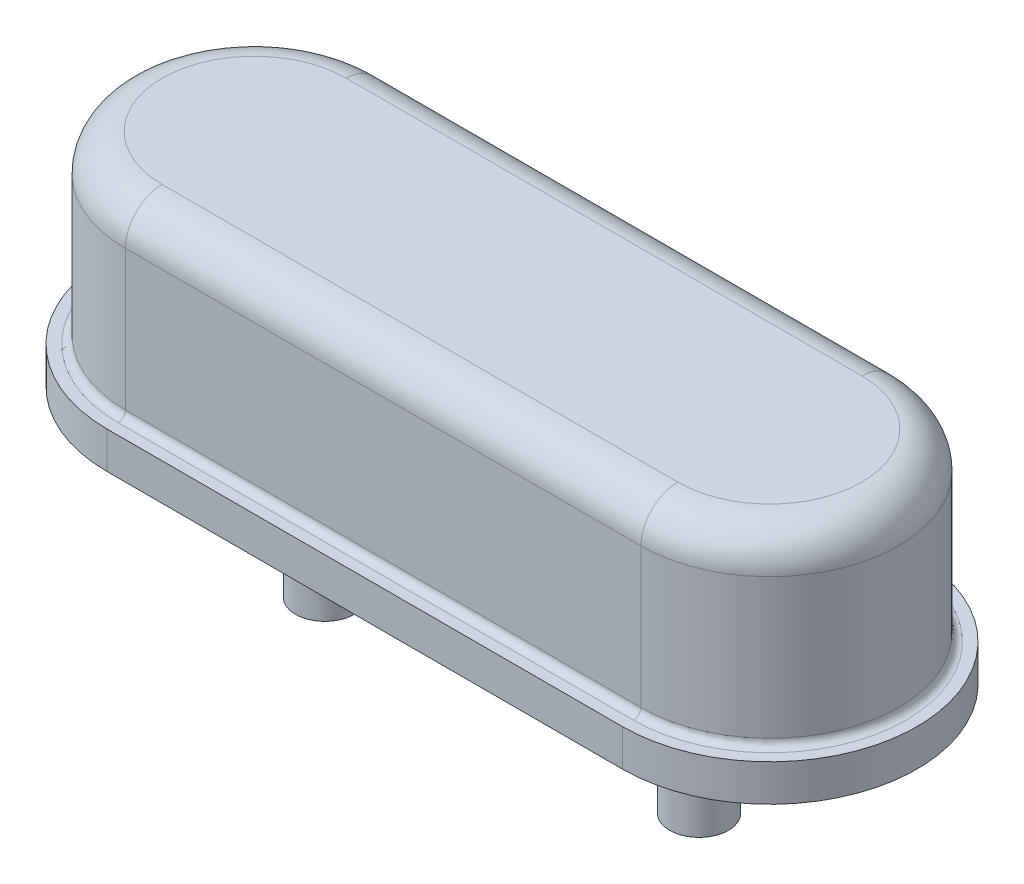
ISO-10303-21;
HEADER;
FILE_DESCRIPTION(('STEP AP214'),'2;1');
FILE_NAME('part.step','',(''),(''),'','','');
FILE_SCHEMA(('AUTOMOTIVE_DESIGN { 1 0 10303 214 1 1 1 1 }'));
ENDSEC;
DATA;
#1=APPLICATION_CONTEXT('core data for automotive mechanical design processes');
#2=APPLICATION_PROTOCOL_DEFINITION('international standard','automotive_design',2000,#1);
#3=PRODUCT_CONTEXT('',#1,'mechanical');
#4=PRODUCT('Part','Part','',(#3));
#5=PRODUCT_RELATED_PRODUCT_CATEGORY('part','',(#4));
#6=PRODUCT_DEFINITION_FORMATION('','',#4);
#7=PRODUCT_DEFINITION_CONTEXT('part definition',#1,'design');
#8=PRODUCT_DEFINITION('design','',#6,#7);
#9=PRODUCT_DEFINITION_SHAPE('','',#8);
#10=(LENGTH_UNIT() NAMED_UNIT(*) SI_UNIT(.MILLI.,.METRE.));
#11=(NAMED_UNIT(*) PLANE_ANGLE_UNIT() SI_UNIT($,.RADIAN.));
#12=(NAMED_UNIT(*) SI_UNIT($,.STERADIAN.) SOLID_ANGLE_UNIT());
#13=UNCERTAINTY_MEASURE_WITH_UNIT(LENGTH_MEASURE(1.E-05),#10,'distance_accuracy_value','');
#14=(GEOMETRIC_REPRESENTATION_CONTEXT(3) GLOBAL_UNCERTAINTY_ASSIGNED_CONTEXT((#13)) GLOBAL_UNIT_ASSIGNED_CONTEXT((#10,
#11,#12)) REPRESENTATION_CONTEXT('',''));
#15=CARTESIAN_POINT('',(0.,0.,0.));
#16=DIRECTION('',(0.,0.,1.));
#17=DIRECTION('',(1.,0.,0.));
#18=AXIS2_PLACEMENT_3D('',#15,#16,#17);
#19=CARTESIAN_POINT('',(-3.5,3.,0.));
#20=DIRECTION('',(0.,-1.,0.));
#21=DIRECTION('',(0.,0.,-1.));
#22=AXIS2_PLACEMENT_3D('',#19,#20,#21);
#23=CYLINDRICAL_SURFACE('',#22,2.);
#24=CARTESIAN_POINT('',(-3.5,0.5,0.));
#25=DIRECTION('',(0.,1.,0.));
#26=DIRECTION('',(0.,0.,1.));
#27=AXIS2_PLACEMENT_3D('',#24,#25,#26);
#28=CIRCLE('',#27,2.);
#29=CARTESIAN_POINT('',(-3.5,0.5,-2.));
#30=VERTEX_POINT('',#29);
#31=CARTESIAN_POINT('',(-3.5,0.5,2.));
#32=VERTEX_POINT('',#31);
#33=EDGE_CURVE('E121',#30,#32,#28,.T.);
#34=ORIENTED_EDGE('',*,*,#33,.F.);
#35=DIRECTION('',(0.,-1.,0.));
#36=VECTOR('',#35,1.);
#37=CARTESIAN_POINT('',(-3.5,3.,-2.));
#38=LINE('',#37,#36);
#39=CARTESIAN_POINT('',(-3.5,0.,-2.));
#40=VERTEX_POINT('',#39);
#41=EDGE_CURVE('E243',#30,#40,#38,.T.);
#42=ORIENTED_EDGE('',*,*,#41,.T.);
#43=CARTESIAN_POINT('',(-3.5,0.,0.));
#44=DIRECTION('',(0.,1.,0.));
#45=DIRECTION('',(0.,0.,1.));
#46=AXIS2_PLACEMENT_3D('',#43,#44,#45);
#47=CIRCLE('',#46,2.);
#48=CARTESIAN_POINT('',(-3.5,0.,2.));
#49=VERTEX_POINT('',#48);
#50=EDGE_CURVE('E144',#40,#49,#47,.T.);
#51=ORIENTED_EDGE('',*,*,#50,.T.);
#52=DIRECTION('',(0.,-1.,0.));
#53=VECTOR('',#52,1.);
#54=CARTESIAN_POINT('',(-3.5,3.,2.));
#55=LINE('',#54,#53);
#56=EDGE_CURVE('E137',#32,#49,#55,.T.);
#57=ORIENTED_EDGE('',*,*,#56,.F.);
#58=EDGE_LOOP('',(#34,#42,#51,#57));
#59=FACE_BOUND('',#58,.T.);
#60=ADVANCED_FACE('F33',(#59),#23,.T.);
#61=CARTESIAN_POINT('',(-3.5,3.,2.));
#62=DIRECTION('',(0.,0.,-1.));
#63=DIRECTION('',(-1.,0.,0.));
#64=AXIS2_PLACEMENT_3D('',#61,#62,#63);
#65=PLANE('',#64);
#66=DIRECTION('',(1.,0.,0.));
#67=VECTOR('',#66,1.);
#68=CARTESIAN_POINT('',(-3.5,0.5,2.));
#69=LINE('',#68,#67);
#70=CARTESIAN_POINT('',(3.5,0.5,2.));
#71=VERTEX_POINT('',#70);
#72=EDGE_CURVE('E124',#32,#71,#69,.T.);
#73=ORIENTED_EDGE('',*,*,#72,.F.);
#74=ORIENTED_EDGE('',*,*,#56,.T.);
#75=DIRECTION('',(1.,0.,0.));
#76=VECTOR('',#75,1.);
#77=CARTESIAN_POINT('',(-3.5,0.,2.));
#78=LINE('',#77,#76);
#79=CARTESIAN_POINT('',(3.5,0.,2.));
#80=VERTEX_POINT('',#79);
#81=EDGE_CURVE('E235',#49,#80,#78,.T.);
#82=ORIENTED_EDGE('',*,*,#81,.T.);
#83=DIRECTION('',(0.,-1.,0.));
#84=VECTOR('',#83,1.);
#85=CARTESIAN_POINT('',(3.5,3.,2.));
#86=LINE('',#85,#84);
#87=EDGE_CURVE('E139',#71,#80,#86,.T.);
#88=ORIENTED_EDGE('',*,*,#87,.F.);
#89=EDGE_LOOP('',(#73,#74,#82,#88));
#90=FACE_BOUND('',#89,.T.);
#91=ADVANCED_FACE('F135',(#90),#65,.F.);
#92=CARTESIAN_POINT('',(3.5,3.,0.));
#93=DIRECTION('',(0.,-1.,0.));
#94=DIRECTION('',(0.,0.,-1.));
#95=AXIS2_PLACEMENT_3D('',#92,#93,#94);
#96=CYLINDRICAL_SURFACE('',#95,2.);
#97=CARTESIAN_POINT('',(3.5,0.5,0.));
#98=DIRECTION('',(0.,1.,0.));
#99=DIRECTION('',(0.,0.,1.));
#100=AXIS2_PLACEMENT_3D('',#97,#98,#99);
#101=CIRCLE('',#100,2.);
#102=CARTESIAN_POINT('',(3.5,0.5,-2.));
#103=VERTEX_POINT('',#102);
#104=EDGE_CURVE('E140',#71,#103,#101,.T.);
#105=ORIENTED_EDGE('',*,*,#104,.F.);
#106=ORIENTED_EDGE('',*,*,#87,.T.);
#107=CARTESIAN_POINT('',(3.5,0.,0.));
#108=DIRECTION('',(0.,1.,0.));
#109=DIRECTION('',(0.,0.,1.));
#110=AXIS2_PLACEMENT_3D('',#107,#108,#109);
#111=CIRCLE('',#110,2.);
#112=CARTESIAN_POINT('',(3.5,0.,-2.));
#113=VERTEX_POINT('',#112);
#114=EDGE_CURVE('E237',#80,#113,#111,.T.);
#115=ORIENTED_EDGE('',*,*,#114,.T.);
#116=DIRECTION('',(0.,-1.,0.));
#117=VECTOR('',#116,1.);
#118=CARTESIAN_POINT('',(3.5,3.,-2.));
#119=LINE('',#118,#117);
#120=EDGE_CURVE('E149',#103,#113,#119,.T.);
#121=ORIENTED_EDGE('',*,*,#120,.F.);
#122=EDGE_LOOP('',(#105,#106,#115,#121));
#123=FACE_BOUND('',#122,.T.);
#124=ADVANCED_FACE('F250',(#123),#96,.T.);
#125=CARTESIAN_POINT('',(-3.5,3.,-2.));
#126=DIRECTION('',(0.,0.,1.));
#127=DIRECTION('',(1.,0.,0.));
#128=AXIS2_PLACEMENT_3D('',#125,#126,#127);
#129=PLANE('',#128);
#130=DIRECTION('',(-1.,0.,0.));
#131=VECTOR('',#130,1.);
#132=CARTESIAN_POINT('',(3.5,0.5,-2.));
#133=LINE('',#132,#131);
#134=EDGE_CURVE('E127',#103,#30,#133,.T.);
#135=ORIENTED_EDGE('',*,*,#134,.F.);
#136=ORIENTED_EDGE('',*,*,#120,.T.);
#137=DIRECTION('',(-1.,0.,0.));
#138=VECTOR('',#137,1.);
#139=CARTESIAN_POINT('',(-3.5,0.,-2.));
#140=LINE('',#139,#138);
#141=EDGE_CURVE('E240',#113,#40,#140,.T.);
#142=ORIENTED_EDGE('',*,*,#141,.T.);
#143=ORIENTED_EDGE('',*,*,#41,.F.);
#144=EDGE_LOOP('',(#135,#136,#142,#143));
#145=FACE_BOUND('',#144,.T.);
#146=ADVANCED_FACE('F246',(#145),#129,.F.);
#147=CARTESIAN_POINT('',(-3.5,0.,0.));
#148=DIRECTION('',(0.,1.,0.));
#149=DIRECTION('',(0.,0.,1.));
#150=AXIS2_PLACEMENT_3D('',#147,#148,#149);
#151=PLANE('',#150);
#152=CARTESIAN_POINT('',(2.54,0.,0.));
#153=DIRECTION('',(0.,1.,0.));
#154=DIRECTION('',(0.,0.,1.));
#155=AXIS2_PLACEMENT_3D('',#152,#153,#154);
#156=CIRCLE('',#155,0.4);
#157=CARTESIAN_POINT('',(2.54,0.,0.4));
#158=VERTEX_POINT('',#157);
#159=EDGE_CURVE('E187',#158,#158,#156,.F.);
#160=ORIENTED_EDGE('',*,*,#159,.F.);
#161=EDGE_LOOP('',(#160));
#162=FACE_BOUND('',#161,.T.);
#163=CARTESIAN_POINT('',(-2.54,0.,0.));
#164=DIRECTION('',(0.,1.,0.));
#165=DIRECTION('',(0.,0.,1.));
#166=AXIS2_PLACEMENT_3D('',#163,#164,#165);
#167=CIRCLE('',#166,0.4);
#168=CARTESIAN_POINT('',(-2.54,0.,0.4));
#169=VERTEX_POINT('',#168);
#170=EDGE_CURVE('E171',#169,#169,#167,.F.);
#171=ORIENTED_EDGE('',*,*,#170,.F.);
#172=EDGE_LOOP('',(#171));
#173=FACE_BOUND('',#172,.T.);
#174=ORIENTED_EDGE('',*,*,#50,.F.);
#175=ORIENTED_EDGE('',*,*,#141,.F.);
#176=ORIENTED_EDGE('',*,*,#114,.F.);
#177=ORIENTED_EDGE('',*,*,#81,.F.);
#178=EDGE_LOOP('',(#174,#175,#176,#177));
#179=FACE_BOUND('',#178,.T.);
#180=ADVANCED_FACE('F252',(#162,#173,#179),#151,.F.);
#181=CARTESIAN_POINT('',(-3.5,0.5,0.));
#182=DIRECTION('',(0.,1.,0.));
#183=DIRECTION('',(0.,0.,1.));
#184=AXIS2_PLACEMENT_3D('',#181,#182,#183);
#185=PLANE('',#184);
#186=DIRECTION('',(1.,0.,0.));
#187=VECTOR('',#186,1.);
#188=CARTESIAN_POINT('',(-3.5,0.5,1.85));
#189=LINE('',#188,#187);
#190=CARTESIAN_POINT('',(3.5,0.5,1.85));
#191=VERTEX_POINT('',#190);
#192=CARTESIAN_POINT('',(-3.5,0.5,1.85));
#193=VERTEX_POINT('',#192);
#194=EDGE_CURVE('E193',#191,#193,#189,.F.);
#195=ORIENTED_EDGE('',*,*,#194,.T.);
#196=CARTESIAN_POINT('',(-3.5,0.5,0.));
#197=DIRECTION('',(0.,1.,0.));
#198=DIRECTION('',(0.,0.,1.));
#199=AXIS2_PLACEMENT_3D('',#196,#197,#198);
#200=CIRCLE('',#199,1.85);
#201=CARTESIAN_POINT('',(-3.5,0.5,-1.85));
#202=VERTEX_POINT('',#201);
#203=EDGE_CURVE('E199',#193,#202,#200,.F.);
#204=ORIENTED_EDGE('',*,*,#203,.T.);
#205=DIRECTION('',(-1.,0.,0.));
#206=VECTOR('',#205,1.);
#207=CARTESIAN_POINT('',(3.5,0.5,-1.85));
#208=LINE('',#207,#206);
#209=CARTESIAN_POINT('',(3.5,0.5,-1.85));
#210=VERTEX_POINT('',#209);
#211=EDGE_CURVE('E197',#202,#210,#208,.F.);
#212=ORIENTED_EDGE('',*,*,#211,.T.);
#213=CARTESIAN_POINT('',(3.5,0.5,0.));
#214=DIRECTION('',(0.,1.,0.));
#215=DIRECTION('',(0.,0.,1.));
#216=AXIS2_PLACEMENT_3D('',#213,#214,#215);
#217=CIRCLE('',#216,1.85);
#218=EDGE_CURVE('E195',#210,#191,#217,.F.);
#219=ORIENTED_EDGE('',*,*,#218,.T.);
#220=EDGE_LOOP('',(#195,#204,#212,#219));
#221=FACE_BOUND('',#220,.T.);
#222=ORIENTED_EDGE('',*,*,#33,.T.);
#223=ORIENTED_EDGE('',*,*,#72,.T.);
#224=ORIENTED_EDGE('',*,*,#104,.T.);
#225=ORIENTED_EDGE('',*,*,#134,.T.);
#226=EDGE_LOOP('',(#222,#223,#224,#225));
#227=FACE_BOUND('',#226,.T.);
#228=ADVANCED_FACE('F123',(#221,#227),#185,.T.);
#229=CARTESIAN_POINT('',(-3.5,0.5,0.));
#230=DIRECTION('',(0.,1.,0.));
#231=DIRECTION('',(0.,0.,1.));
#232=AXIS2_PLACEMENT_3D('',#229,#230,#231);
#233=CYLINDRICAL_SURFACE('',#232,1.75);
#234=DIRECTION('',(0.,1.,0.));
#235=VECTOR('',#234,1.);
#236=CARTESIAN_POINT('',(-3.5,0.5,-1.75));
#237=LINE('',#236,#235);
#238=CARTESIAN_POINT('',(-3.5,0.6,-1.75));
#239=VERTEX_POINT('',#238);
#240=CARTESIAN_POINT('',(-3.5,2.5,-1.75));
#241=VERTEX_POINT('',#240);
#242=EDGE_CURVE('E131',#239,#241,#237,.T.);
#243=ORIENTED_EDGE('',*,*,#242,.F.);
#244=CARTESIAN_POINT('',(-3.5,0.6,0.));
#245=DIRECTION('',(0.,1.,0.));
#246=DIRECTION('',(0.,0.,1.));
#247=AXIS2_PLACEMENT_3D('',#244,#245,#246);
#248=CIRCLE('',#247,1.75);
#249=CARTESIAN_POINT('',(-3.5,0.6,1.75));
#250=VERTEX_POINT('',#249);
#251=EDGE_CURVE('E190',#239,#250,#248,.T.);
#252=ORIENTED_EDGE('',*,*,#251,.T.);
#253=DIRECTION('',(0.,1.,0.));
#254=VECTOR('',#253,1.);
#255=CARTESIAN_POINT('',(-3.5,0.5,1.75));
#256=LINE('',#255,#254);
#257=CARTESIAN_POINT('',(-3.5,2.5,1.75));
#258=VERTEX_POINT('',#257);
#259=EDGE_CURVE('E184',#250,#258,#256,.T.);
#260=ORIENTED_EDGE('',*,*,#259,.T.);
#261=CARTESIAN_POINT('',(-3.5,2.5,0.));
#262=DIRECTION('',(0.,1.,0.));
#263=DIRECTION('',(0.,0.,1.));
#264=AXIS2_PLACEMENT_3D('',#261,#262,#263);
#265=CIRCLE('',#264,1.75);
#266=EDGE_CURVE('E159',#258,#241,#265,.F.);
#267=ORIENTED_EDGE('',*,*,#266,.T.);
#268=EDGE_LOOP('',(#243,#252,#260,#267));
#269=FACE_BOUND('',#268,.T.);
#270=ADVANCED_FACE('F260',(#269),#233,.T.);
#271=CARTESIAN_POINT('',(3.5,0.5,-1.75));
#272=DIRECTION('',(0.,0.,-1.));
#273=DIRECTION('',(-1.,0.,0.));
#274=AXIS2_PLACEMENT_3D('',#271,#272,#273);
#275=PLANE('',#274);
#276=DIRECTION('',(0.,1.,0.));
#277=VECTOR('',#276,1.);
#278=CARTESIAN_POINT('',(3.5,0.5,-1.75));
#279=LINE('',#278,#277);
#280=CARTESIAN_POINT('',(3.5,0.6,-1.75));
#281=VERTEX_POINT('',#280);
#282=CARTESIAN_POINT('',(3.5,2.5,-1.75));
#283=VERTEX_POINT('',#282);
#284=EDGE_CURVE('E227',#281,#283,#279,.T.);
#285=ORIENTED_EDGE('',*,*,#284,.F.);
#286=DIRECTION('',(-1.,0.,0.));
#287=VECTOR('',#286,1.);
#288=CARTESIAN_POINT('',(-3.5,0.6,-1.75));
#289=LINE('',#288,#287);
#290=EDGE_CURVE('E202',#281,#239,#289,.T.);
#291=ORIENTED_EDGE('',*,*,#290,.T.);
#292=ORIENTED_EDGE('',*,*,#242,.T.);
#293=DIRECTION('',(-1.,0.,0.));
#294=VECTOR('',#293,1.);
#295=CARTESIAN_POINT('',(3.5,2.5,-1.75));
#296=LINE('',#295,#294);
#297=EDGE_CURVE('E162',#241,#283,#296,.F.);
#298=ORIENTED_EDGE('',*,*,#297,.T.);
#299=EDGE_LOOP('',(#285,#291,#292,#298));
#300=FACE_BOUND('',#299,.T.);
#301=ADVANCED_FACE('F318',(#300),#275,.T.);
#302=CARTESIAN_POINT('',(3.5,0.5,0.));
#303=DIRECTION('',(0.,1.,0.));
#304=DIRECTION('',(0.,0.,1.));
#305=AXIS2_PLACEMENT_3D('',#302,#303,#304);
#306=CYLINDRICAL_SURFACE('',#305,1.75);
#307=DIRECTION('',(0.,1.,0.));
#308=VECTOR('',#307,1.);
#309=CARTESIAN_POINT('',(3.5,0.5,1.75));
#310=LINE('',#309,#308);
#311=CARTESIAN_POINT('',(3.5,0.6,1.75));
#312=VERTEX_POINT('',#311);
#313=CARTESIAN_POINT('',(3.5,2.5,1.75));
#314=VERTEX_POINT('',#313);
#315=EDGE_CURVE('E229',#312,#314,#310,.T.);
#316=ORIENTED_EDGE('',*,*,#315,.F.);
#317=CARTESIAN_POINT('',(3.5,0.6,0.));
#318=DIRECTION('',(0.,1.,0.));
#319=DIRECTION('',(0.,0.,1.));
#320=AXIS2_PLACEMENT_3D('',#317,#318,#319);
#321=CIRCLE('',#320,1.75);
#322=EDGE_CURVE('E42',#312,#281,#321,.T.);
#323=ORIENTED_EDGE('',*,*,#322,.T.);
#324=ORIENTED_EDGE('',*,*,#284,.T.);
#325=CARTESIAN_POINT('',(3.5,2.5,0.));
#326=DIRECTION('',(0.,1.,0.));
#327=DIRECTION('',(0.,0.,1.));
#328=AXIS2_PLACEMENT_3D('',#325,#326,#327);
#329=CIRCLE('',#328,1.75);
#330=EDGE_CURVE('E165',#283,#314,#329,.F.);
#331=ORIENTED_EDGE('',*,*,#330,.T.);
#332=EDGE_LOOP('',(#316,#323,#324,#331));
#333=FACE_BOUND('',#332,.T.);
#334=ADVANCED_FACE('F333',(#333),#306,.T.);
#335=CARTESIAN_POINT('',(-3.5,0.5,1.75));
#336=DIRECTION('',(0.,0.,1.));
#337=DIRECTION('',(1.,0.,0.));
#338=AXIS2_PLACEMENT_3D('',#335,#336,#337);
#339=PLANE('',#338);
#340=ORIENTED_EDGE('',*,*,#259,.F.);
#341=DIRECTION('',(1.,0.,0.));
#342=VECTOR('',#341,1.);
#343=CARTESIAN_POINT('',(3.5,0.6,1.75));
#344=LINE('',#343,#342);
#345=EDGE_CURVE('E11',#250,#312,#344,.T.);
#346=ORIENTED_EDGE('',*,*,#345,.T.);
#347=ORIENTED_EDGE('',*,*,#315,.T.);
#348=DIRECTION('',(1.,0.,0.));
#349=VECTOR('',#348,1.);
#350=CARTESIAN_POINT('',(-3.5,2.5,1.75));
#351=LINE('',#350,#349);
#352=EDGE_CURVE('E168',#314,#258,#351,.F.);
#353=ORIENTED_EDGE('',*,*,#352,.T.);
#354=EDGE_LOOP('',(#340,#346,#347,#353));
#355=FACE_BOUND('',#354,.T.);
#356=ADVANCED_FACE('F334',(#355),#339,.T.);
#357=CARTESIAN_POINT('',(-3.5,3.,0.));
#358=DIRECTION('',(0.,1.,0.));
#359=DIRECTION('',(0.,0.,1.));
#360=AXIS2_PLACEMENT_3D('',#357,#358,#359);
#361=PLANE('',#360);
#362=DIRECTION('',(-1.,0.,0.));
#363=VECTOR('',#362,1.);
#364=CARTESIAN_POINT('',(-3.5,3.,-1.25));
#365=LINE('',#364,#363);
#366=CARTESIAN_POINT('',(3.5,3.,-1.25));
#367=VERTEX_POINT('',#366);
#368=CARTESIAN_POINT('',(-3.5,3.,-1.25));
#369=VERTEX_POINT('',#368);
#370=EDGE_CURVE('E154',#367,#369,#365,.T.);
#371=ORIENTED_EDGE('',*,*,#370,.T.);
#372=CARTESIAN_POINT('',(-3.5,3.,0.));
#373=DIRECTION('',(0.,1.,0.));
#374=DIRECTION('',(0.,0.,1.));
#375=AXIS2_PLACEMENT_3D('',#372,#373,#374);
#376=CIRCLE('',#375,1.25);
#377=CARTESIAN_POINT('',(-3.5,3.,1.25));
#378=VERTEX_POINT('',#377);
#379=EDGE_CURVE('E156',#369,#378,#376,.T.);
#380=ORIENTED_EDGE('',*,*,#379,.T.);
#381=DIRECTION('',(1.,0.,0.));
#382=VECTOR('',#381,1.);
#383=CARTESIAN_POINT('',(-3.5,3.,1.25));
#384=LINE('',#383,#382);
#385=CARTESIAN_POINT('',(3.5,3.,1.25));
#386=VERTEX_POINT('',#385);
#387=EDGE_CURVE('E145',#378,#386,#384,.T.);
#388=ORIENTED_EDGE('',*,*,#387,.T.);
#389=CARTESIAN_POINT('',(3.5,3.,0.));
#390=DIRECTION('',(0.,1.,0.));
#391=DIRECTION('',(0.,0.,1.));
#392=AXIS2_PLACEMENT_3D('',#389,#390,#391);
#393=CIRCLE('',#392,1.25);
#394=EDGE_CURVE('E147',#386,#367,#393,.T.);
#395=ORIENTED_EDGE('',*,*,#394,.T.);
#396=EDGE_LOOP('',(#371,#380,#388,#395));
#397=FACE_BOUND('',#396,.T.);
#398=ADVANCED_FACE('F291',(#397),#361,.T.);
#399=CARTESIAN_POINT('',(3.5,2.5,0.));
#400=DIRECTION('',(0.,1.,0.));
#401=DIRECTION('',(0.,0.,1.));
#402=AXIS2_PLACEMENT_3D('',#399,#400,#401);
#403=TOROIDAL_SURFACE('',#402,1.25,0.5);
#404=CARTESIAN_POINT('',(3.5,2.5,1.25));
#405=DIRECTION('',(-1.,0.,0.));
#406=DIRECTION('',(0.,0.,1.));
#407=AXIS2_PLACEMENT_3D('',#404,#405,#406);
#408=CIRCLE('',#407,0.5);
#409=EDGE_CURVE('E178',#314,#386,#408,.T.);
#410=ORIENTED_EDGE('',*,*,#409,.F.);
#411=ORIENTED_EDGE('',*,*,#330,.F.);
#412=CARTESIAN_POINT('',(3.5,2.5,-1.25));
#413=DIRECTION('',(-1.,0.,0.));
#414=DIRECTION('',(0.,0.,1.));
#415=AXIS2_PLACEMENT_3D('',#412,#413,#414);
#416=CIRCLE('',#415,0.5);
#417=EDGE_CURVE('E181',#367,#283,#416,.T.);
#418=ORIENTED_EDGE('',*,*,#417,.F.);
#419=ORIENTED_EDGE('',*,*,#394,.F.);
#420=EDGE_LOOP('',(#410,#411,#418,#419));
#421=FACE_BOUND('',#420,.T.);
#422=ADVANCED_FACE('F287',(#421),#403,.T.);
#423=CARTESIAN_POINT('',(-3.5,2.5,-1.25));
#424=DIRECTION('',(-1.,0.,0.));
#425=DIRECTION('',(0.,0.,1.));
#426=AXIS2_PLACEMENT_3D('',#423,#424,#425);
#427=CYLINDRICAL_SURFACE('',#426,0.5);
#428=ORIENTED_EDGE('',*,*,#417,.T.);
#429=ORIENTED_EDGE('',*,*,#297,.F.);
#430=CARTESIAN_POINT('',(-3.5,2.5,-1.25));
#431=DIRECTION('',(-1.,0.,0.));
#432=DIRECTION('',(0.,0.,1.));
#433=AXIS2_PLACEMENT_3D('',#430,#431,#432);
#434=CIRCLE('',#433,0.5);
#435=EDGE_CURVE('E174',#369,#241,#434,.T.);
#436=ORIENTED_EDGE('',*,*,#435,.F.);
#437=ORIENTED_EDGE('',*,*,#370,.F.);
#438=EDGE_LOOP('',(#428,#429,#436,#437));
#439=FACE_BOUND('',#438,.T.);
#440=ADVANCED_FACE('F283',(#439),#427,.T.);
#441=CARTESIAN_POINT('',(-3.5,2.5,1.25));
#442=DIRECTION('',(1.,0.,0.));
#443=DIRECTION('',(0.,0.,-1.));
#444=AXIS2_PLACEMENT_3D('',#441,#442,#443);
#445=CYLINDRICAL_SURFACE('',#444,0.5);
#446=ORIENTED_EDGE('',*,*,#409,.T.);
#447=ORIENTED_EDGE('',*,*,#387,.F.);
#448=CARTESIAN_POINT('',(-3.5,2.5,1.25));
#449=DIRECTION('',(-1.,0.,0.));
#450=DIRECTION('',(0.,0.,1.));
#451=AXIS2_PLACEMENT_3D('',#448,#449,#450);
#452=CIRCLE('',#451,0.5);
#453=EDGE_CURVE('E172',#258,#378,#452,.T.);
#454=ORIENTED_EDGE('',*,*,#453,.F.);
#455=ORIENTED_EDGE('',*,*,#352,.F.);
#456=EDGE_LOOP('',(#446,#447,#454,#455));
#457=FACE_BOUND('',#456,.T.);
#458=ADVANCED_FACE('F279',(#457),#445,.T.);
#459=CARTESIAN_POINT('',(-3.5,2.5,0.));
#460=DIRECTION('',(0.,1.,0.));
#461=DIRECTION('',(0.,0.,1.));
#462=AXIS2_PLACEMENT_3D('',#459,#460,#461);
#463=TOROIDAL_SURFACE('',#462,1.25,0.5);
#464=ORIENTED_EDGE('',*,*,#435,.T.);
#465=ORIENTED_EDGE('',*,*,#266,.F.);
#466=ORIENTED_EDGE('',*,*,#453,.T.);
#467=ORIENTED_EDGE('',*,*,#379,.F.);
#468=EDGE_LOOP('',(#464,#465,#466,#467));
#469=FACE_BOUND('',#468,.T.);
#470=ADVANCED_FACE('F275',(#469),#463,.T.);
#471=CARTESIAN_POINT('',(-2.54,-2.,0.));
#472=DIRECTION('',(0.,1.,0.));
#473=DIRECTION('',(0.,0.,1.));
#474=AXIS2_PLACEMENT_3D('',#471,#472,#473);
#475=CYLINDRICAL_SURFACE('',#474,0.4);
#476=CARTESIAN_POINT('',(-2.54,-2.,0.));
#477=DIRECTION('',(0.,-1.,0.));
#478=DIRECTION('',(0.,0.,-1.));
#479=AXIS2_PLACEMENT_3D('',#476,#477,#478);
#480=CIRCLE('',#479,0.4);
#481=CARTESIAN_POINT('',(-2.54,-2.,-0.4));
#482=VERTEX_POINT('',#481);
#483=EDGE_CURVE('E175',#482,#482,#480,.T.);
#484=ORIENTED_EDGE('',*,*,#483,.F.);
#485=EDGE_LOOP('',(#484));
#486=FACE_BOUND('',#485,.T.);
#487=ORIENTED_EDGE('',*,*,#170,.T.);
#488=EDGE_LOOP('',(#487));
#489=FACE_BOUND('',#488,.T.);
#490=ADVANCED_FACE('F278',(#486,#489),#475,.T.);
#491=CARTESIAN_POINT('',(-2.54,-2.,0.));
#492=DIRECTION('',(0.,-1.,0.));
#493=DIRECTION('',(0.,0.,-1.));
#494=AXIS2_PLACEMENT_3D('',#491,#492,#493);
#495=PLANE('',#494);
#496=ORIENTED_EDGE('',*,*,#483,.T.);
#497=EDGE_LOOP('',(#496));
#498=FACE_BOUND('',#497,.T.);
#499=ADVANCED_FACE('F353',(#498),#495,.T.);
#500=CARTESIAN_POINT('',(2.54,-2.,0.));
#501=DIRECTION('',(0.,1.,0.));
#502=DIRECTION('',(0.,0.,1.));
#503=AXIS2_PLACEMENT_3D('',#500,#501,#502);
#504=CYLINDRICAL_SURFACE('',#503,0.4);
#505=CARTESIAN_POINT('',(2.54,-2.,0.));
#506=DIRECTION('',(0.,-1.,0.));
#507=DIRECTION('',(0.,0.,-1.));
#508=AXIS2_PLACEMENT_3D('',#505,#506,#507);
#509=CIRCLE('',#508,0.4);
#510=CARTESIAN_POINT('',(2.54,-2.,-0.4));
#511=VERTEX_POINT('',#510);
#512=EDGE_CURVE('E214',#511,#511,#509,.T.);
#513=ORIENTED_EDGE('',*,*,#512,.F.);
#514=EDGE_LOOP('',(#513));
#515=FACE_BOUND('',#514,.T.);
#516=ORIENTED_EDGE('',*,*,#159,.T.);
#517=EDGE_LOOP('',(#516));
#518=FACE_BOUND('',#517,.T.);
#519=ADVANCED_FACE('F309',(#515,#518),#504,.T.);
#520=CARTESIAN_POINT('',(2.54,-2.,0.));
#521=DIRECTION('',(0.,-1.,0.));
#522=DIRECTION('',(0.,0.,-1.));
#523=AXIS2_PLACEMENT_3D('',#520,#521,#522);
#524=PLANE('',#523);
#525=ORIENTED_EDGE('',*,*,#512,.T.);
#526=EDGE_LOOP('',(#525));
#527=FACE_BOUND('',#526,.T.);
#528=ADVANCED_FACE('F304',(#527),#524,.T.);
#529=CARTESIAN_POINT('',(3.5,0.6,0.));
#530=DIRECTION('',(0.,1.,0.));
#531=DIRECTION('',(0.,0.,1.));
#532=AXIS2_PLACEMENT_3D('',#529,#530,#531);
#533=TOROIDAL_SURFACE('',#532,1.85,0.1);
#534=CARTESIAN_POINT('',(3.5,0.6,1.85));
#535=DIRECTION('',(1.,0.,0.));
#536=DIRECTION('',(0.,0.,-1.));
#537=AXIS2_PLACEMENT_3D('',#534,#535,#536);
#538=CIRCLE('',#537,0.1);
#539=EDGE_CURVE('E208',#191,#312,#538,.T.);
#540=ORIENTED_EDGE('',*,*,#539,.F.);
#541=ORIENTED_EDGE('',*,*,#218,.F.);
#542=CARTESIAN_POINT('',(3.5,0.6,-1.85));
#543=DIRECTION('',(1.,0.,0.));
#544=DIRECTION('',(0.,0.,-1.));
#545=AXIS2_PLACEMENT_3D('',#542,#543,#544);
#546=CIRCLE('',#545,0.1);
#547=EDGE_CURVE('E37',#281,#210,#546,.T.);
#548=ORIENTED_EDGE('',*,*,#547,.F.);
#549=ORIENTED_EDGE('',*,*,#322,.F.);
#550=EDGE_LOOP('',(#540,#541,#548,#549));
#551=FACE_BOUND('',#550,.T.);
#552=ADVANCED_FACE('F35',(#551),#533,.F.);
#553=CARTESIAN_POINT('',(3.5,0.6,-1.85));
#554=DIRECTION('',(1.,0.,0.));
#555=DIRECTION('',(0.,0.,-1.));
#556=AXIS2_PLACEMENT_3D('',#553,#554,#555);
#557=CYLINDRICAL_SURFACE('',#556,0.1);
#558=ORIENTED_EDGE('',*,*,#547,.T.);
#559=ORIENTED_EDGE('',*,*,#211,.F.);
#560=CARTESIAN_POINT('',(-3.5,0.6,-1.85));
#561=DIRECTION('',(1.,0.,0.));
#562=DIRECTION('',(0.,0.,-1.));
#563=AXIS2_PLACEMENT_3D('',#560,#561,#562);
#564=CIRCLE('',#563,0.1);
#565=EDGE_CURVE('E207',#239,#202,#564,.T.);
#566=ORIENTED_EDGE('',*,*,#565,.F.);
#567=ORIENTED_EDGE('',*,*,#290,.F.);
#568=EDGE_LOOP('',(#558,#559,#566,#567));
#569=FACE_BOUND('',#568,.T.);
#570=ADVANCED_FACE('F299',(#569),#557,.F.);
#571=CARTESIAN_POINT('',(-3.5,0.6,1.85));
#572=DIRECTION('',(-1.,0.,0.));
#573=DIRECTION('',(0.,0.,1.));
#574=AXIS2_PLACEMENT_3D('',#571,#572,#573);
#575=CYLINDRICAL_SURFACE('',#574,0.1);
#576=ORIENTED_EDGE('',*,*,#539,.T.);
#577=ORIENTED_EDGE('',*,*,#345,.F.);
#578=CARTESIAN_POINT('',(-3.5,0.6,1.85));
#579=DIRECTION('',(1.,0.,0.));
#580=DIRECTION('',(0.,0.,-1.));
#581=AXIS2_PLACEMENT_3D('',#578,#579,#580);
#582=CIRCLE('',#581,0.1);
#583=EDGE_CURVE('E205',#193,#250,#582,.T.);
#584=ORIENTED_EDGE('',*,*,#583,.F.);
#585=ORIENTED_EDGE('',*,*,#194,.F.);
#586=EDGE_LOOP('',(#576,#577,#584,#585));
#587=FACE_BOUND('',#586,.T.);
#588=ADVANCED_FACE('F296',(#587),#575,.F.);
#589=CARTESIAN_POINT('',(-3.5,0.6,0.));
#590=DIRECTION('',(0.,1.,0.));
#591=DIRECTION('',(0.,0.,1.));
#592=AXIS2_PLACEMENT_3D('',#589,#590,#591);
#593=TOROIDAL_SURFACE('',#592,1.85,0.1);
#594=ORIENTED_EDGE('',*,*,#565,.T.);
#595=ORIENTED_EDGE('',*,*,#203,.F.);
#596=ORIENTED_EDGE('',*,*,#583,.T.);
#597=ORIENTED_EDGE('',*,*,#251,.F.);
#598=EDGE_LOOP('',(#594,#595,#596,#597));
#599=FACE_BOUND('',#598,.T.);
#600=ADVANCED_FACE('F293',(#599),#593,.F.);
#601=CLOSED_SHELL('',(#60,#91,#124,#146,#180,#228,#270,#301,#334,#356,#398,#422,#440,#458,#470,
#490,#499,#519,#528,#552,#570,#588,#600));
#602=MANIFOLD_SOLID_BREP('B2',#601);
#603=ADVANCED_BREP_SHAPE_REPRESENTATION('',(#18,#602),#14);
#604=SHAPE_DEFINITION_REPRESENTATION(#9,#603);
ENDSEC;
END-ISO-10303-21;
